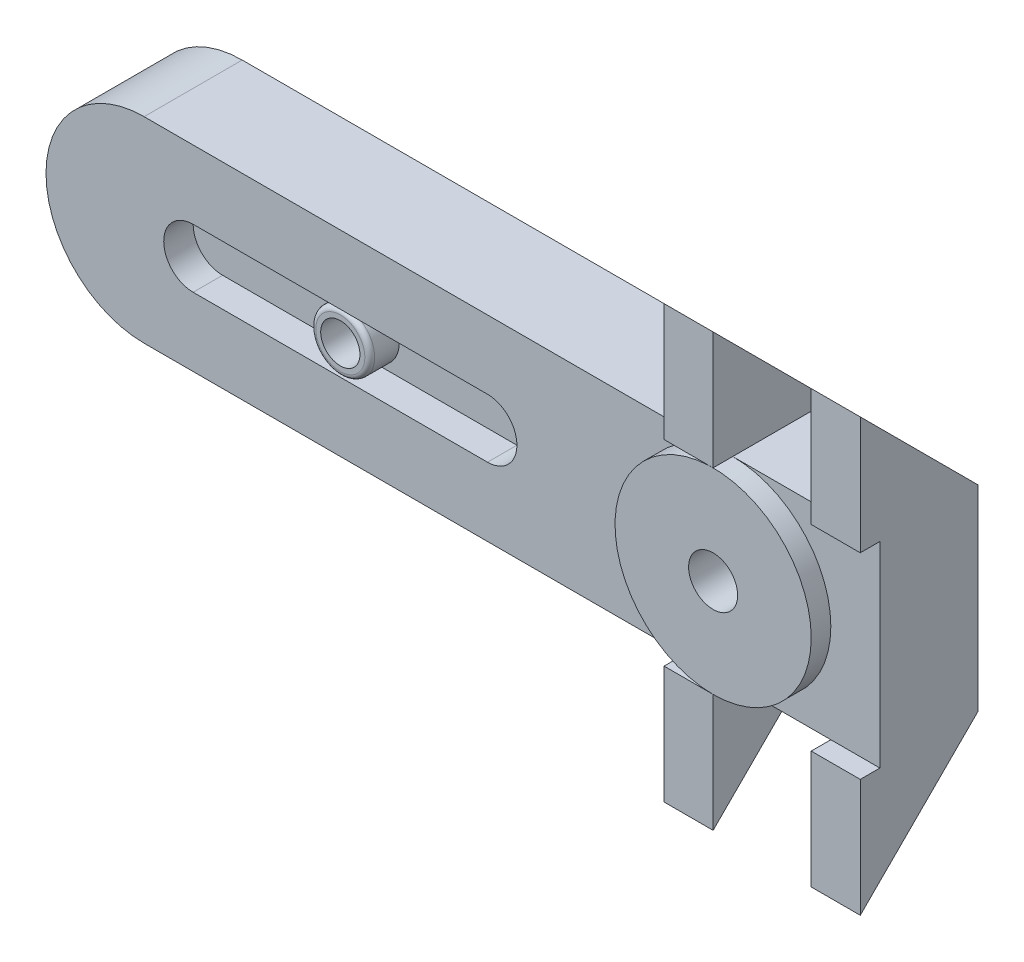
ISO-10303-21;
HEADER;
FILE_DESCRIPTION(('STEP AP214'),'2;1');
FILE_NAME('part.step','',(''),(''),'','','');
FILE_SCHEMA(('AUTOMOTIVE_DESIGN { 1 0 10303 214 1 1 1 1 }'));
ENDSEC;
DATA;
#1=APPLICATION_CONTEXT('core data for automotive mechanical design processes');
#2=APPLICATION_PROTOCOL_DEFINITION('international standard','automotive_design',2000,#1);
#3=PRODUCT_CONTEXT('',#1,'mechanical');
#4=PRODUCT('Part','Part','',(#3));
#5=PRODUCT_RELATED_PRODUCT_CATEGORY('part','',(#4));
#6=PRODUCT_DEFINITION_FORMATION('','',#4);
#7=PRODUCT_DEFINITION_CONTEXT('part definition',#1,'design');
#8=PRODUCT_DEFINITION('design','',#6,#7);
#9=PRODUCT_DEFINITION_SHAPE('','',#8);
#10=(LENGTH_UNIT() NAMED_UNIT(*) SI_UNIT(.MILLI.,.METRE.));
#11=(NAMED_UNIT(*) PLANE_ANGLE_UNIT() SI_UNIT($,.RADIAN.));
#12=(NAMED_UNIT(*) SI_UNIT($,.STERADIAN.) SOLID_ANGLE_UNIT());
#13=UNCERTAINTY_MEASURE_WITH_UNIT(LENGTH_MEASURE(1.E-05),#10,'distance_accuracy_value','');
#14=(GEOMETRIC_REPRESENTATION_CONTEXT(3) GLOBAL_UNCERTAINTY_ASSIGNED_CONTEXT((#13)) GLOBAL_UNIT_ASSIGNED_CONTEXT((#10,
#11,#12)) REPRESENTATION_CONTEXT('',''));
#15=CARTESIAN_POINT('',(0.,0.,0.));
#16=DIRECTION('',(0.,0.,1.));
#17=DIRECTION('',(1.,0.,0.));
#18=AXIS2_PLACEMENT_3D('',#15,#16,#17);
#19=CARTESIAN_POINT('',(16.8518561611012,-19.728530633822,-5.));
#20=DIRECTION('',(-1.,0.,0.));
#21=DIRECTION('',(0.,0.,1.));
#22=AXIS2_PLACEMENT_3D('',#19,#20,#21);
#23=PLANE('',#22);
#24=DIRECTION('',(0.,0.707106781186546,-0.707106781186549));
#25=VECTOR('',#24,1.);
#26=CARTESIAN_POINT('',(16.8518561611012,-13.7285306338219,0.999999999999997));
#27=LINE('',#26,#25);
#28=CARTESIAN_POINT('',(16.8518561611012,-19.728530633822,7.00000000000004));
#29=VERTEX_POINT('',#28);
#30=CARTESIAN_POINT('',(16.8518561611012,-7.72853063382195,-5.));
#31=VERTEX_POINT('',#30);
#32=EDGE_CURVE('E85',#29,#31,#27,.T.);
#33=ORIENTED_EDGE('',*,*,#32,.F.);
#34=DIRECTION('',(0.,-1.,0.));
#35=VECTOR('',#34,1.);
#36=CARTESIAN_POINT('',(16.8518561611012,-19.728530633822,7.));
#37=LINE('',#36,#35);
#38=CARTESIAN_POINT('',(16.8518561611012,-7.72853063382195,7.));
#39=VERTEX_POINT('',#38);
#40=EDGE_CURVE('E101',#39,#29,#37,.T.);
#41=ORIENTED_EDGE('',*,*,#40,.F.);
#42=DIRECTION('',(0.,0.,1.));
#43=VECTOR('',#42,1.);
#44=CARTESIAN_POINT('',(16.8518561611012,-7.72853063382195,-5.));
#45=LINE('',#44,#43);
#46=EDGE_CURVE('E12',#31,#39,#45,.T.);
#47=ORIENTED_EDGE('',*,*,#46,.F.);
#48=EDGE_LOOP('',(#33,#41,#47));
#49=FACE_BOUND('',#48,.T.);
#50=ADVANCED_FACE('F48',(#49),#23,.T.);
#51=CARTESIAN_POINT('',(16.8518561611012,-7.72853063382195,-5.));
#52=DIRECTION('',(0.,1.,0.));
#53=DIRECTION('',(0.,0.,1.));
#54=AXIS2_PLACEMENT_3D('',#51,#52,#53);
#55=PLANE('',#54);
#56=DIRECTION('',(-1.,0.,0.));
#57=VECTOR('',#56,1.);
#58=CARTESIAN_POINT('',(16.8518561611012,-7.72853063382195,7.));
#59=LINE('',#58,#57);
#60=CARTESIAN_POINT('',(21.8518561611012,-7.72853063382195,7.));
#61=VERTEX_POINT('',#60);
#62=EDGE_CURVE('E86',#61,#39,#59,.T.);
#63=ORIENTED_EDGE('',*,*,#62,.F.);
#64=DIRECTION('',(0.,0.,1.));
#65=VECTOR('',#64,1.);
#66=CARTESIAN_POINT('',(21.8518561611012,-7.72853063382195,-5.));
#67=LINE('',#66,#65);
#68=CARTESIAN_POINT('',(21.8518561611012,-7.72853063382195,-5.));
#69=VERTEX_POINT('',#68);
#70=EDGE_CURVE('E51',#69,#61,#67,.T.);
#71=ORIENTED_EDGE('',*,*,#70,.F.);
#72=DIRECTION('',(-1.,0.,0.));
#73=VECTOR('',#72,1.);
#74=CARTESIAN_POINT('',(16.8518561611012,-7.72853063382195,-5.));
#75=LINE('',#74,#73);
#76=EDGE_CURVE('E81',#69,#31,#75,.T.);
#77=ORIENTED_EDGE('',*,*,#76,.T.);
#78=ORIENTED_EDGE('',*,*,#46,.T.);
#79=EDGE_LOOP('',(#63,#71,#77,#78));
#80=FACE_BOUND('',#79,.T.);
#81=ADVANCED_FACE('F92',(#80),#55,.T.);
#82=CARTESIAN_POINT('',(21.8518561611012,-19.728530633822,-5.));
#83=DIRECTION('',(1.,0.,0.));
#84=DIRECTION('',(0.,0.,-1.));
#85=AXIS2_PLACEMENT_3D('',#82,#83,#84);
#86=PLANE('',#85);
#87=DIRECTION('',(0.,-0.707106781186546,0.707106781186549));
#88=VECTOR('',#87,1.);
#89=CARTESIAN_POINT('',(21.8518561611012,-19.728530633822,7.00000000000004));
#90=LINE('',#89,#88);
#91=CARTESIAN_POINT('',(21.8518561611012,-19.728530633822,7.));
#92=VERTEX_POINT('',#91);
#93=EDGE_CURVE('E83',#69,#92,#90,.T.);
#94=ORIENTED_EDGE('',*,*,#93,.F.);
#95=ORIENTED_EDGE('',*,*,#70,.T.);
#96=DIRECTION('',(0.,1.,0.));
#97=VECTOR('',#96,1.);
#98=CARTESIAN_POINT('',(21.8518561611012,-19.728530633822,7.));
#99=LINE('',#98,#97);
#100=EDGE_CURVE('E89',#92,#61,#99,.T.);
#101=ORIENTED_EDGE('',*,*,#100,.F.);
#102=EDGE_LOOP('',(#94,#95,#101));
#103=FACE_BOUND('',#102,.T.);
#104=ADVANCED_FACE('F88',(#103),#86,.T.);
#105=CARTESIAN_POINT('',(0.,0.,7.));
#106=DIRECTION('',(0.,0.,-1.));
#107=DIRECTION('',(-1.,0.,0.));
#108=AXIS2_PLACEMENT_3D('',#105,#106,#107);
#109=PLANE('',#108);
#110=ORIENTED_EDGE('',*,*,#40,.T.);
#111=DIRECTION('',(1.,0.,0.));
#112=VECTOR('',#111,1.);
#113=CARTESIAN_POINT('',(16.8518561611012,-19.728530633822,7.));
#114=LINE('',#113,#112);
#115=EDGE_CURVE('E97',#29,#92,#114,.T.);
#116=ORIENTED_EDGE('',*,*,#115,.T.);
#117=ORIENTED_EDGE('',*,*,#100,.T.);
#118=ORIENTED_EDGE('',*,*,#62,.T.);
#119=EDGE_LOOP('',(#110,#116,#117,#118));
#120=FACE_BOUND('',#119,.T.);
#121=ADVANCED_FACE('F103',(#120),#109,.F.);
#122=CARTESIAN_POINT('',(9.85185616110118,-19.728530633822,7.00000000000004));
#123=DIRECTION('',(0.,0.707106781186549,0.707106781186546));
#124=DIRECTION('',(0.,-0.707106781186546,0.707106781186549));
#125=AXIS2_PLACEMENT_3D('',#122,#123,#124);
#126=PLANE('',#125);
#127=ORIENTED_EDGE('',*,*,#32,.T.);
#128=ORIENTED_EDGE('',*,*,#76,.F.);
#129=ORIENTED_EDGE('',*,*,#93,.T.);
#130=ORIENTED_EDGE('',*,*,#115,.F.);
#131=EDGE_LOOP('',(#127,#128,#129,#130));
#132=FACE_BOUND('',#131,.T.);
#133=ADVANCED_FACE('F82',(#132),#126,.F.);
#134=CLOSED_SHELL('',(#50,#81,#104,#121,#133));
#135=MANIFOLD_SOLID_BREP('B2',#134);
#136=CARTESIAN_POINT('',(16.8518561611012,24.271469366178,-5.));
#137=DIRECTION('',(-1.,0.,0.));
#138=DIRECTION('',(0.,0.,1.));
#139=AXIS2_PLACEMENT_3D('',#136,#137,#138);
#140=PLANE('',#139);
#141=DIRECTION('',(0.,0.707106781186548,0.707106781186548));
#142=VECTOR('',#141,1.);
#143=CARTESIAN_POINT('',(16.8518561611012,18.271469366178,1.));
#144=LINE('',#143,#142);
#145=CARTESIAN_POINT('',(16.8518561611012,12.271469366178,-5.));
#146=VERTEX_POINT('',#145);
#147=CARTESIAN_POINT('',(16.8518561611012,24.271469366178,7.));
#148=VERTEX_POINT('',#147);
#149=EDGE_CURVE('E170',#146,#148,#144,.T.);
#150=ORIENTED_EDGE('',*,*,#149,.F.);
#151=DIRECTION('',(0.,0.,1.));
#152=VECTOR('',#151,1.);
#153=CARTESIAN_POINT('',(16.8518561611012,12.271469366178,-5.));
#154=LINE('',#153,#152);
#155=CARTESIAN_POINT('',(16.8518561611012,12.271469366178,7.));
#156=VERTEX_POINT('',#155);
#157=EDGE_CURVE('E159',#146,#156,#154,.T.);
#158=ORIENTED_EDGE('',*,*,#157,.T.);
#159=DIRECTION('',(0.,-1.,0.));
#160=VECTOR('',#159,1.);
#161=CARTESIAN_POINT('',(16.8518561611012,24.271469366178,7.));
#162=LINE('',#161,#160);
#163=EDGE_CURVE('E205',#148,#156,#162,.T.);
#164=ORIENTED_EDGE('',*,*,#163,.F.);
#165=EDGE_LOOP('',(#150,#158,#164));
#166=FACE_BOUND('',#165,.T.);
#167=ADVANCED_FACE('F156',(#166),#140,.T.);
#168=CARTESIAN_POINT('',(21.8518561611012,24.271469366178,-5.));
#169=DIRECTION('',(1.,0.,0.));
#170=DIRECTION('',(0.,1.,0.));
#171=AXIS2_PLACEMENT_3D('',#168,#169,#170);
#172=PLANE('',#171);
#173=DIRECTION('',(0.,-0.707106781186548,-0.707106781186548));
#174=VECTOR('',#173,1.);
#175=CARTESIAN_POINT('',(21.8518561611012,12.271469366178,-5.));
#176=LINE('',#175,#174);
#177=CARTESIAN_POINT('',(21.8518561611012,24.271469366178,7.));
#178=VERTEX_POINT('',#177);
#179=CARTESIAN_POINT('',(21.8518561611012,12.271469366178,-5.));
#180=VERTEX_POINT('',#179);
#181=EDGE_CURVE('E188',#178,#180,#176,.T.);
#182=ORIENTED_EDGE('',*,*,#181,.F.);
#183=DIRECTION('',(0.,1.,0.));
#184=VECTOR('',#183,1.);
#185=CARTESIAN_POINT('',(21.8518561611012,24.271469366178,7.));
#186=LINE('',#185,#184);
#187=CARTESIAN_POINT('',(21.8518561611012,12.271469366178,7.));
#188=VERTEX_POINT('',#187);
#189=EDGE_CURVE('E197',#188,#178,#186,.T.);
#190=ORIENTED_EDGE('',*,*,#189,.F.);
#191=DIRECTION('',(0.,0.,1.));
#192=VECTOR('',#191,1.);
#193=CARTESIAN_POINT('',(21.8518561611012,12.271469366178,-5.));
#194=LINE('',#193,#192);
#195=EDGE_CURVE('E46',#180,#188,#194,.T.);
#196=ORIENTED_EDGE('',*,*,#195,.F.);
#197=EDGE_LOOP('',(#182,#190,#196));
#198=FACE_BOUND('',#197,.T.);
#199=ADVANCED_FACE('F196',(#198),#172,.T.);
#200=CARTESIAN_POINT('',(16.8518561611012,12.271469366178,-5.));
#201=DIRECTION('',(0.,-1.,0.));
#202=DIRECTION('',(0.,0.,-1.));
#203=AXIS2_PLACEMENT_3D('',#200,#201,#202);
#204=PLANE('',#203);
#205=DIRECTION('',(1.,0.,0.));
#206=VECTOR('',#205,1.);
#207=CARTESIAN_POINT('',(16.8518561611012,12.271469366178,7.));
#208=LINE('',#207,#206);
#209=EDGE_CURVE('E208',#156,#188,#208,.T.);
#210=ORIENTED_EDGE('',*,*,#209,.F.);
#211=ORIENTED_EDGE('',*,*,#157,.F.);
#212=DIRECTION('',(1.,0.,0.));
#213=VECTOR('',#212,1.);
#214=CARTESIAN_POINT('',(16.8518561611012,12.271469366178,-5.));
#215=LINE('',#214,#213);
#216=EDGE_CURVE('E190',#146,#180,#215,.T.);
#217=ORIENTED_EDGE('',*,*,#216,.T.);
#218=ORIENTED_EDGE('',*,*,#195,.T.);
#219=EDGE_LOOP('',(#210,#211,#217,#218));
#220=FACE_BOUND('',#219,.T.);
#221=ADVANCED_FACE('F200',(#220),#204,.T.);
#222=CARTESIAN_POINT('',(0.,0.,7.));
#223=DIRECTION('',(0.,0.,1.));
#224=DIRECTION('',(1.,0.,0.));
#225=AXIS2_PLACEMENT_3D('',#222,#223,#224);
#226=PLANE('',#225);
#227=ORIENTED_EDGE('',*,*,#163,.T.);
#228=ORIENTED_EDGE('',*,*,#209,.T.);
#229=ORIENTED_EDGE('',*,*,#189,.T.);
#230=DIRECTION('',(-1.,0.,0.));
#231=VECTOR('',#230,1.);
#232=CARTESIAN_POINT('',(16.8518561611012,24.271469366178,7.));
#233=LINE('',#232,#231);
#234=EDGE_CURVE('E192',#178,#148,#233,.T.);
#235=ORIENTED_EDGE('',*,*,#234,.T.);
#236=EDGE_LOOP('',(#227,#228,#229,#235));
#237=FACE_BOUND('',#236,.T.);
#238=ADVANCED_FACE('F211',(#237),#226,.T.);
#239=CARTESIAN_POINT('',(9.85185616110117,12.271469366178,-5.));
#240=DIRECTION('',(0.,-0.707106781186547,0.707106781186547));
#241=DIRECTION('',(0.,-0.707106781186548,-0.707106781186548));
#242=AXIS2_PLACEMENT_3D('',#239,#240,#241);
#243=PLANE('',#242);
#244=ORIENTED_EDGE('',*,*,#149,.T.);
#245=ORIENTED_EDGE('',*,*,#234,.F.);
#246=ORIENTED_EDGE('',*,*,#181,.T.);
#247=ORIENTED_EDGE('',*,*,#216,.F.);
#248=EDGE_LOOP('',(#244,#245,#246,#247));
#249=FACE_BOUND('',#248,.T.);
#250=ADVANCED_FACE('F189',(#249),#243,.F.);
#251=CLOSED_SHELL('',(#167,#199,#221,#238,#250));
#252=MANIFOLD_SOLID_BREP('B6',#251);
#253=CARTESIAN_POINT('',(41.8518561611012,-7.72853063382194,-5.));
#254=DIRECTION('',(0.,1.,0.));
#255=DIRECTION('',(0.,0.,1.));
#256=AXIS2_PLACEMENT_3D('',#253,#254,#255);
#257=PLANE('',#256);
#258=DIRECTION('',(0.,0.,1.));
#259=VECTOR('',#258,1.);
#260=CARTESIAN_POINT('',(31.8518561611012,-7.72853063382195,-5.));
#261=LINE('',#260,#259);
#262=CARTESIAN_POINT('',(31.8518561611012,-7.72853063382195,-5.));
#263=VERTEX_POINT('',#262);
#264=CARTESIAN_POINT('',(31.8518561611012,-7.72853063382192,5.));
#265=VERTEX_POINT('',#264);
#266=EDGE_CURVE('E374',#263,#265,#261,.T.);
#267=ORIENTED_EDGE('',*,*,#266,.T.);
#268=DIRECTION('',(1.,0.,0.));
#269=VECTOR('',#268,1.);
#270=CARTESIAN_POINT('',(0.,-7.72853063382195,5.));
#271=LINE('',#270,#269);
#272=CARTESIAN_POINT('',(21.8518561611012,-7.72853063382195,5.));
#273=VERTEX_POINT('',#272);
#274=EDGE_CURVE('E451',#273,#265,#271,.T.);
#275=ORIENTED_EDGE('',*,*,#274,.F.);
#276=CARTESIAN_POINT('',(-38.1481438388988,-7.72853063382194,5.));
#277=VERTEX_POINT('',#276);
#278=EDGE_CURVE('E453',#277,#273,#271,.T.);
#279=ORIENTED_EDGE('',*,*,#278,.F.);
#280=DIRECTION('',(0.,0.,-1.));
#281=VECTOR('',#280,1.);
#282=CARTESIAN_POINT('',(-38.1481438388988,-7.72853063382194,-5.));
#283=LINE('',#282,#281);
#284=CARTESIAN_POINT('',(-38.1481438388988,-7.72853063382194,-5.));
#285=VERTEX_POINT('',#284);
#286=EDGE_CURVE('E399',#277,#285,#283,.T.);
#287=ORIENTED_EDGE('',*,*,#286,.T.);
#288=DIRECTION('',(-1.,0.,0.));
#289=VECTOR('',#288,1.);
#290=CARTESIAN_POINT('',(41.8518561611012,-7.72853063382194,-5.));
#291=LINE('',#290,#289);
#292=EDGE_CURVE('E397',#263,#285,#291,.T.);
#293=ORIENTED_EDGE('',*,*,#292,.F.);
#294=EDGE_LOOP('',(#267,#275,#279,#287,#293));
#295=FACE_BOUND('',#294,.T.);
#296=ADVANCED_FACE('F263',(#295),#257,.F.);
#297=CARTESIAN_POINT('',(31.8518561611012,12.271469366178,-5.));
#298=DIRECTION('',(0.,-1.,0.));
#299=DIRECTION('',(0.,0.,-1.));
#300=AXIS2_PLACEMENT_3D('',#297,#298,#299);
#301=PLANE('',#300);
#302=DIRECTION('',(0.,0.,-1.));
#303=VECTOR('',#302,1.);
#304=CARTESIAN_POINT('',(31.8518561611012,12.271469366178,-5.));
#305=LINE('',#304,#303);
#306=CARTESIAN_POINT('',(31.8518561611012,12.271469366178,7.));
#307=VERTEX_POINT('',#306);
#308=CARTESIAN_POINT('',(31.8518561611012,12.271469366178,5.));
#309=VERTEX_POINT('',#308);
#310=EDGE_CURVE('E522',#307,#309,#305,.T.);
#311=ORIENTED_EDGE('',*,*,#310,.T.);
#312=DIRECTION('',(1.,0.,0.));
#313=VECTOR('',#312,1.);
#314=CARTESIAN_POINT('',(0.,12.2714693661781,5.));
#315=LINE('',#314,#313);
#316=CARTESIAN_POINT('',(36.8518561611012,12.271469366178,5.));
#317=VERTEX_POINT('',#316);
#318=EDGE_CURVE('E449',#309,#317,#315,.T.);
#319=ORIENTED_EDGE('',*,*,#318,.T.);
#320=DIRECTION('',(0.,0.,-1.));
#321=VECTOR('',#320,1.);
#322=CARTESIAN_POINT('',(36.8518561611012,12.271469366178,-5.));
#323=LINE('',#322,#321);
#324=CARTESIAN_POINT('',(36.8518561611012,12.271469366178,7.));
#325=VERTEX_POINT('',#324);
#326=EDGE_CURVE('E504',#325,#317,#323,.T.);
#327=ORIENTED_EDGE('',*,*,#326,.F.);
#328=DIRECTION('',(1.,0.,0.));
#329=VECTOR('',#328,1.);
#330=CARTESIAN_POINT('',(31.8518561611012,12.271469366178,7.));
#331=LINE('',#330,#329);
#332=EDGE_CURVE('E519',#307,#325,#331,.T.);
#333=ORIENTED_EDGE('',*,*,#332,.F.);
#334=EDGE_LOOP('',(#311,#319,#327,#333));
#335=FACE_BOUND('',#334,.T.);
#336=ADVANCED_FACE('F550',(#335),#301,.T.);
#337=CARTESIAN_POINT('',(-38.1481438388988,2.27146936617805,-5.));
#338=DIRECTION('',(0.,0.,-1.));
#339=DIRECTION('',(-1.,0.,0.));
#340=AXIS2_PLACEMENT_3D('',#337,#338,#339);
#341=CYLINDRICAL_SURFACE('',#340,10.);
#342=DIRECTION('',(0.,0.,-1.));
#343=VECTOR('',#342,1.);
#344=CARTESIAN_POINT('',(-48.1481438388988,2.27146936617806,-5.));
#345=LINE('',#344,#343);
#346=CARTESIAN_POINT('',(-48.1481438388988,2.27146936617806,-5.));
#347=VERTEX_POINT('',#346);
#348=CARTESIAN_POINT('',(-48.1481438388988,2.27146936617806,5.));
#349=VERTEX_POINT('',#348);
#350=EDGE_CURVE('E417',#347,#349,#345,.F.);
#351=ORIENTED_EDGE('',*,*,#350,.T.);
#352=CARTESIAN_POINT('',(-38.1481438388988,2.27146936617806,5.));
#353=DIRECTION('',(0.,0.,-1.));
#354=DIRECTION('',(-1.,0.,0.));
#355=AXIS2_PLACEMENT_3D('',#352,#353,#354);
#356=CIRCLE('',#355,10.);
#357=CARTESIAN_POINT('',(-38.1481438388988,12.2714693661781,5.));
#358=VERTEX_POINT('',#357);
#359=EDGE_CURVE('E432',#358,#349,#356,.F.);
#360=ORIENTED_EDGE('',*,*,#359,.F.);
#361=DIRECTION('',(0.,0.,-1.));
#362=VECTOR('',#361,1.);
#363=CARTESIAN_POINT('',(-38.1481438388988,12.2714693661781,-5.));
#364=LINE('',#363,#362);
#365=CARTESIAN_POINT('',(-38.1481438388988,12.2714693661781,-5.));
#366=VERTEX_POINT('',#365);
#367=EDGE_CURVE('E271',#366,#358,#364,.F.);
#368=ORIENTED_EDGE('',*,*,#367,.F.);
#369=CARTESIAN_POINT('',(-38.1481438388988,2.27146936617805,-5.));
#370=DIRECTION('',(0.,0.,-1.));
#371=DIRECTION('',(-1.,0.,0.));
#372=AXIS2_PLACEMENT_3D('',#369,#370,#371);
#373=CIRCLE('',#372,10.);
#374=EDGE_CURVE('E154',#347,#366,#373,.T.);
#375=ORIENTED_EDGE('',*,*,#374,.F.);
#376=EDGE_LOOP('',(#351,#360,#368,#375));
#377=FACE_BOUND('',#376,.T.);
#378=ADVANCED_FACE('F265',(#377),#341,.T.);
#379=CARTESIAN_POINT('',(-38.1481438388988,2.27146936617806,-5.));
#380=DIRECTION('',(0.,0.,-1.));
#381=DIRECTION('',(-1.,0.,0.));
#382=AXIS2_PLACEMENT_3D('',#379,#380,#381);
#383=CYLINDRICAL_SURFACE('',#382,10.);
#384=ORIENTED_EDGE('',*,*,#286,.F.);
#385=CARTESIAN_POINT('',(-38.1481438388988,2.27146936617806,5.));
#386=DIRECTION('',(0.,0.,-1.));
#387=DIRECTION('',(-1.,0.,0.));
#388=AXIS2_PLACEMENT_3D('',#385,#386,#387);
#389=CIRCLE('',#388,10.);
#390=EDGE_CURVE('E438',#349,#277,#389,.F.);
#391=ORIENTED_EDGE('',*,*,#390,.F.);
#392=ORIENTED_EDGE('',*,*,#350,.F.);
#393=CARTESIAN_POINT('',(-38.1481438388988,2.27146936617806,-5.));
#394=DIRECTION('',(0.,0.,-1.));
#395=DIRECTION('',(-1.,0.,0.));
#396=AXIS2_PLACEMENT_3D('',#393,#394,#395);
#397=CIRCLE('',#396,10.);
#398=EDGE_CURVE('E419',#285,#347,#397,.T.);
#399=ORIENTED_EDGE('',*,*,#398,.F.);
#400=EDGE_LOOP('',(#384,#391,#392,#399));
#401=FACE_BOUND('',#400,.T.);
#402=ADVANCED_FACE('F558',(#401),#383,.T.);
#403=CARTESIAN_POINT('',(41.8518561611012,12.271469366178,-5.));
#404=DIRECTION('',(0.,-1.,0.));
#405=DIRECTION('',(1.,0.,0.));
#406=AXIS2_PLACEMENT_3D('',#403,#404,#405);
#407=PLANE('',#406);
#408=ORIENTED_EDGE('',*,*,#367,.T.);
#409=CARTESIAN_POINT('',(21.8518561611012,12.271469366178,5.));
#410=VERTEX_POINT('',#409);
#411=EDGE_CURVE('E427',#358,#410,#315,.T.);
#412=ORIENTED_EDGE('',*,*,#411,.T.);
#413=EDGE_CURVE('E447',#410,#309,#315,.T.);
#414=ORIENTED_EDGE('',*,*,#413,.T.);
#415=CARTESIAN_POINT('',(31.8518561611012,12.271469366178,-5.));
#416=VERTEX_POINT('',#415);
#417=EDGE_CURVE('E587',#309,#416,#305,.T.);
#418=ORIENTED_EDGE('',*,*,#417,.T.);
#419=DIRECTION('',(1.,0.,0.));
#420=VECTOR('',#419,1.);
#421=CARTESIAN_POINT('',(41.8518561611012,12.271469366178,-5.));
#422=LINE('',#421,#420);
#423=EDGE_CURVE('E411',#366,#416,#422,.T.);
#424=ORIENTED_EDGE('',*,*,#423,.F.);
#425=EDGE_LOOP('',(#408,#412,#414,#418,#424));
#426=FACE_BOUND('',#425,.T.);
#427=ADVANCED_FACE('F424',(#426),#407,.F.);
#428=CARTESIAN_POINT('',(0.,0.,-5.));
#429=DIRECTION('',(0.,0.,-1.));
#430=DIRECTION('',(-1.,0.,0.));
#431=AXIS2_PLACEMENT_3D('',#428,#429,#430);
#432=PLANE('',#431);
#433=DIRECTION('',(0.,-1.,0.));
#434=VECTOR('',#433,1.);
#435=CARTESIAN_POINT('',(36.8518561611012,12.271469366178,-5.));
#436=LINE('',#435,#434);
#437=CARTESIAN_POINT('',(36.8518561611012,12.271469366178,-5.));
#438=VERTEX_POINT('',#437);
#439=CARTESIAN_POINT('',(36.8518561611012,-7.72853063382195,-5.));
#440=VERTEX_POINT('',#439);
#441=EDGE_CURVE('E410',#438,#440,#436,.T.);
#442=ORIENTED_EDGE('',*,*,#441,.T.);
#443=EDGE_CURVE('E391',#440,#263,#291,.T.);
#444=ORIENTED_EDGE('',*,*,#443,.T.);
#445=ORIENTED_EDGE('',*,*,#292,.T.);
#446=ORIENTED_EDGE('',*,*,#398,.T.);
#447=ORIENTED_EDGE('',*,*,#374,.T.);
#448=ORIENTED_EDGE('',*,*,#423,.T.);
#449=DIRECTION('',(1.,0.,0.));
#450=VECTOR('',#449,1.);
#451=CARTESIAN_POINT('',(31.8518561611012,12.271469366178,-5.));
#452=LINE('',#451,#450);
#453=EDGE_CURVE('E517',#416,#438,#452,.T.);
#454=ORIENTED_EDGE('',*,*,#453,.T.);
#455=EDGE_LOOP('',(#442,#444,#445,#446,#447,#448,#454));
#456=FACE_BOUND('',#455,.T.);
#457=CARTESIAN_POINT('',(21.8518561611012,2.27146936617805,-5.));
#458=DIRECTION('',(0.,0.,1.));
#459=DIRECTION('',(1.,0.,0.));
#460=AXIS2_PLACEMENT_3D('',#457,#458,#459);
#461=CIRCLE('',#460,2.5);
#462=CARTESIAN_POINT('',(24.3518561611012,2.27146936617805,-5.));
#463=VERTEX_POINT('',#462);
#464=EDGE_CURVE('E403',#463,#463,#461,.T.);
#465=ORIENTED_EDGE('',*,*,#464,.T.);
#466=EDGE_LOOP('',(#465));
#467=FACE_BOUND('',#466,.T.);
#468=ADVANCED_FACE('F406',(#456,#467),#432,.T.);
#469=CARTESIAN_POINT('',(21.8518561611012,2.27146936617805,-5.));
#470=DIRECTION('',(0.,0.,1.));
#471=DIRECTION('',(1.,0.,0.));
#472=AXIS2_PLACEMENT_3D('',#469,#470,#471);
#473=CYLINDRICAL_SURFACE('',#472,2.5);
#474=ORIENTED_EDGE('',*,*,#464,.F.);
#475=EDGE_LOOP('',(#474));
#476=FACE_BOUND('',#475,.T.);
#477=CARTESIAN_POINT('',(21.8518561611012,2.27146936617805,7.));
#478=DIRECTION('',(0.,0.,1.));
#479=DIRECTION('',(1.,0.,0.));
#480=AXIS2_PLACEMENT_3D('',#477,#478,#479);
#481=CIRCLE('',#480,2.5);
#482=CARTESIAN_POINT('',(24.3518561611012,2.27146936617805,7.));
#483=VERTEX_POINT('',#482);
#484=EDGE_CURVE('E473',#483,#483,#481,.T.);
#485=ORIENTED_EDGE('',*,*,#484,.T.);
#486=EDGE_LOOP('',(#485));
#487=FACE_BOUND('',#486,.T.);
#488=ADVANCED_FACE('F526',(#476,#487),#473,.F.);
#489=CARTESIAN_POINT('',(36.8518561611012,12.271469366178,-5.));
#490=DIRECTION('',(-1.,0.,0.));
#491=DIRECTION('',(0.,0.,1.));
#492=AXIS2_PLACEMENT_3D('',#489,#490,#491);
#493=PLANE('',#492);
#494=DIRECTION('',(0.,-1.,0.));
#495=VECTOR('',#494,1.);
#496=CARTESIAN_POINT('',(36.8518561611012,12.271469366178,5.));
#497=LINE('',#496,#495);
#498=CARTESIAN_POINT('',(36.8518561611012,-7.72853063382195,5.));
#499=VERTEX_POINT('',#498);
#500=EDGE_CURVE('E479',#317,#499,#497,.T.);
#501=ORIENTED_EDGE('',*,*,#500,.T.);
#502=DIRECTION('',(0.,0.,1.));
#503=VECTOR('',#502,1.);
#504=CARTESIAN_POINT('',(36.8518561611012,-7.72853063382195,-5.));
#505=LINE('',#504,#503);
#506=CARTESIAN_POINT('',(36.8518561611012,-7.72853063382191,7.));
#507=VERTEX_POINT('',#506);
#508=EDGE_CURVE('E488',#499,#507,#505,.T.);
#509=ORIENTED_EDGE('',*,*,#508,.T.);
#510=DIRECTION('',(0.,-1.,0.));
#511=VECTOR('',#510,1.);
#512=CARTESIAN_POINT('',(36.8518561611012,-7.72853063382191,7.));
#513=LINE('',#512,#511);
#514=CARTESIAN_POINT('',(36.8518561611012,-19.7285306338219,7.));
#515=VERTEX_POINT('',#514);
#516=EDGE_CURVE('E394',#507,#515,#513,.T.);
#517=ORIENTED_EDGE('',*,*,#516,.T.);
#518=DIRECTION('',(0.,0.707106781186546,-0.707106781186549));
#519=VECTOR('',#518,1.);
#520=CARTESIAN_POINT('',(36.8518561611012,-19.7285306338219,7.));
#521=LINE('',#520,#519);
#522=EDGE_CURVE('E490',#515,#440,#521,.T.);
#523=ORIENTED_EDGE('',*,*,#522,.T.);
#524=ORIENTED_EDGE('',*,*,#441,.F.);
#525=DIRECTION('',(0.,0.707106781186548,0.707106781186548));
#526=VECTOR('',#525,1.);
#527=CARTESIAN_POINT('',(36.8518561611012,24.271469366178,7.));
#528=LINE('',#527,#526);
#529=CARTESIAN_POINT('',(36.8518561611012,24.271469366178,7.));
#530=VERTEX_POINT('',#529);
#531=EDGE_CURVE('E513',#438,#530,#528,.T.);
#532=ORIENTED_EDGE('',*,*,#531,.T.);
#533=DIRECTION('',(0.,-1.,0.));
#534=VECTOR('',#533,1.);
#535=CARTESIAN_POINT('',(36.8518561611012,12.271469366178,7.));
#536=LINE('',#535,#534);
#537=EDGE_CURVE('E507',#530,#325,#536,.T.);
#538=ORIENTED_EDGE('',*,*,#537,.T.);
#539=ORIENTED_EDGE('',*,*,#326,.T.);
#540=EDGE_LOOP('',(#501,#509,#517,#523,#524,#532,#538,#539));
#541=FACE_BOUND('',#540,.T.);
#542=ADVANCED_FACE('F502',(#541),#493,.F.);
#543=CARTESIAN_POINT('',(31.8518561611012,24.271469366178,7.));
#544=DIRECTION('',(0.,0.707106781186548,-0.707106781186548));
#545=DIRECTION('',(0.,0.707106781186548,0.707106781186548));
#546=AXIS2_PLACEMENT_3D('',#543,#544,#545);
#547=PLANE('',#546);
#548=ORIENTED_EDGE('',*,*,#531,.F.);
#549=ORIENTED_EDGE('',*,*,#453,.F.);
#550=DIRECTION('',(0.,0.707106781186548,0.707106781186548));
#551=VECTOR('',#550,1.);
#552=CARTESIAN_POINT('',(31.8518561611012,24.271469366178,7.));
#553=LINE('',#552,#551);
#554=CARTESIAN_POINT('',(31.8518561611012,24.271469366178,7.));
#555=VERTEX_POINT('',#554);
#556=EDGE_CURVE('E508',#416,#555,#553,.T.);
#557=ORIENTED_EDGE('',*,*,#556,.T.);
#558=DIRECTION('',(1.,0.,0.));
#559=VECTOR('',#558,1.);
#560=CARTESIAN_POINT('',(31.8518561611012,24.271469366178,7.));
#561=LINE('',#560,#559);
#562=EDGE_CURVE('E521',#555,#530,#561,.T.);
#563=ORIENTED_EDGE('',*,*,#562,.T.);
#564=EDGE_LOOP('',(#548,#549,#557,#563));
#565=FACE_BOUND('',#564,.T.);
#566=ADVANCED_FACE('F598',(#565),#547,.T.);
#567=CARTESIAN_POINT('',(31.8518561611012,12.271469366178,7.));
#568=DIRECTION('',(0.,0.,1.));
#569=DIRECTION('',(1.,0.,0.));
#570=AXIS2_PLACEMENT_3D('',#567,#568,#569);
#571=PLANE('',#570);
#572=ORIENTED_EDGE('',*,*,#537,.F.);
#573=ORIENTED_EDGE('',*,*,#562,.F.);
#574=DIRECTION('',(0.,-1.,0.));
#575=VECTOR('',#574,1.);
#576=CARTESIAN_POINT('',(31.8518561611012,12.271469366178,7.));
#577=LINE('',#576,#575);
#578=EDGE_CURVE('E511',#555,#307,#577,.T.);
#579=ORIENTED_EDGE('',*,*,#578,.T.);
#580=ORIENTED_EDGE('',*,*,#332,.T.);
#581=EDGE_LOOP('',(#572,#573,#579,#580));
#582=FACE_BOUND('',#581,.T.);
#583=ADVANCED_FACE('F595',(#582),#571,.T.);
#584=CARTESIAN_POINT('',(31.8518561611012,0.,0.));
#585=DIRECTION('',(-1.,0.,0.));
#586=DIRECTION('',(0.,0.,1.));
#587=AXIS2_PLACEMENT_3D('',#584,#585,#586);
#588=PLANE('',#587);
#589=ORIENTED_EDGE('',*,*,#556,.F.);
#590=ORIENTED_EDGE('',*,*,#417,.F.);
#591=ORIENTED_EDGE('',*,*,#310,.F.);
#592=ORIENTED_EDGE('',*,*,#578,.F.);
#593=EDGE_LOOP('',(#589,#590,#591,#592));
#594=FACE_BOUND('',#593,.T.);
#595=ADVANCED_FACE('F592',(#594),#588,.T.);
#596=CARTESIAN_POINT('',(0.,0.,5.));
#597=DIRECTION('',(0.,0.,-1.));
#598=DIRECTION('',(-1.,0.,0.));
#599=AXIS2_PLACEMENT_3D('',#596,#597,#598);
#600=PLANE('',#599);
#601=CARTESIAN_POINT('',(-33.1481438388988,2.27146936617805,5.));
#602=DIRECTION('',(0.,0.,-1.));
#603=DIRECTION('',(-1.,0.,0.));
#604=AXIS2_PLACEMENT_3D('',#601,#602,#603);
#605=CIRCLE('',#604,3.);
#606=CARTESIAN_POINT('',(-33.1481438388988,-0.728530633821944,5.));
#607=VERTEX_POINT('',#606);
#608=CARTESIAN_POINT('',(-33.1481438388988,5.27146936617805,5.));
#609=VERTEX_POINT('',#608);
#610=EDGE_CURVE('E469',#607,#609,#605,.T.);
#611=ORIENTED_EDGE('',*,*,#610,.T.);
#612=DIRECTION('',(1.,0.,0.));
#613=VECTOR('',#612,1.);
#614=CARTESIAN_POINT('',(0.,5.27146936617805,5.));
#615=LINE('',#614,#613);
#616=CARTESIAN_POINT('',(-3.14814383889883,5.27146936617805,5.));
#617=VERTEX_POINT('',#616);
#618=EDGE_CURVE('E455',#609,#617,#615,.T.);
#619=ORIENTED_EDGE('',*,*,#618,.T.);
#620=CARTESIAN_POINT('',(-3.14814383889883,2.27146936617805,5.));
#621=DIRECTION('',(0.,0.,-1.));
#622=DIRECTION('',(-1.,0.,0.));
#623=AXIS2_PLACEMENT_3D('',#620,#621,#622);
#624=CIRCLE('',#623,3.);
#625=CARTESIAN_POINT('',(-3.14814383889883,-0.728530633821944,5.));
#626=VERTEX_POINT('',#625);
#627=EDGE_CURVE('E461',#617,#626,#624,.T.);
#628=ORIENTED_EDGE('',*,*,#627,.T.);
#629=DIRECTION('',(-1.,0.,0.));
#630=VECTOR('',#629,1.);
#631=CARTESIAN_POINT('',(0.,-0.728530633821944,5.));
#632=LINE('',#631,#630);
#633=EDGE_CURVE('E465',#626,#607,#632,.T.);
#634=ORIENTED_EDGE('',*,*,#633,.T.);
#635=EDGE_LOOP('',(#611,#619,#628,#634));
#636=FACE_BOUND('',#635,.T.);
#637=CARTESIAN_POINT('',(21.8518561611012,2.27146936617805,5.));
#638=DIRECTION('',(0.,0.,1.));
#639=DIRECTION('',(1.,0.,0.));
#640=AXIS2_PLACEMENT_3D('',#637,#638,#639);
#641=CIRCLE('',#640,9.99999999999999);
#642=EDGE_CURVE('E444',#410,#273,#641,.T.);
#643=ORIENTED_EDGE('',*,*,#642,.F.);
#644=ORIENTED_EDGE('',*,*,#411,.F.);
#645=ORIENTED_EDGE('',*,*,#359,.T.);
#646=ORIENTED_EDGE('',*,*,#390,.T.);
#647=ORIENTED_EDGE('',*,*,#278,.T.);
#648=EDGE_LOOP('',(#643,#644,#645,#646,#647));
#649=FACE_BOUND('',#648,.T.);
#650=ADVANCED_FACE('F441',(#636,#649),#600,.F.);
#651=ORIENTED_EDGE('',*,*,#274,.T.);
#652=EDGE_CURVE('E446',#265,#499,#271,.T.);
#653=ORIENTED_EDGE('',*,*,#652,.T.);
#654=ORIENTED_EDGE('',*,*,#500,.F.);
#655=ORIENTED_EDGE('',*,*,#318,.F.);
#656=ORIENTED_EDGE('',*,*,#413,.F.);
#657=EDGE_CURVE('E437',#273,#410,#641,.T.);
#658=ORIENTED_EDGE('',*,*,#657,.F.);
#659=EDGE_LOOP('',(#651,#653,#654,#655,#656,#658));
#660=FACE_BOUND('',#659,.T.);
#661=ADVANCED_FACE('F500',(#660),#600,.F.);
#662=CARTESIAN_POINT('',(-33.1481438388988,2.27146936617805,5.));
#663=DIRECTION('',(0.,0.,-1.));
#664=DIRECTION('',(-1.,0.,0.));
#665=AXIS2_PLACEMENT_3D('',#662,#663,#664);
#666=CYLINDRICAL_SURFACE('',#665,3.);
#667=CARTESIAN_POINT('',(-33.1481438388988,2.27146936617805,0.));
#668=DIRECTION('',(0.,0.,-1.));
#669=DIRECTION('',(-1.,0.,0.));
#670=AXIS2_PLACEMENT_3D('',#667,#668,#669);
#671=CIRCLE('',#670,3.);
#672=CARTESIAN_POINT('',(-33.1481438388988,-0.728530633821944,0.));
#673=VERTEX_POINT('',#672);
#674=CARTESIAN_POINT('',(-33.1481438388988,5.27146936617805,0.));
#675=VERTEX_POINT('',#674);
#676=EDGE_CURVE('E476',#673,#675,#671,.T.);
#677=ORIENTED_EDGE('',*,*,#676,.T.);
#678=DIRECTION('',(0.,0.,-1.));
#679=VECTOR('',#678,1.);
#680=CARTESIAN_POINT('',(-33.1481438388988,5.27146936617805,5.));
#681=LINE('',#680,#679);
#682=EDGE_CURVE('E565',#609,#675,#681,.T.);
#683=ORIENTED_EDGE('',*,*,#682,.F.);
#684=ORIENTED_EDGE('',*,*,#610,.F.);
#685=DIRECTION('',(0.,0.,-1.));
#686=VECTOR('',#685,1.);
#687=CARTESIAN_POINT('',(-33.1481438388988,-0.728530633821944,5.));
#688=LINE('',#687,#686);
#689=EDGE_CURVE('E567',#607,#673,#688,.T.);
#690=ORIENTED_EDGE('',*,*,#689,.T.);
#691=EDGE_LOOP('',(#677,#683,#684,#690));
#692=FACE_BOUND('',#691,.T.);
#693=ADVANCED_FACE('F620',(#692),#666,.F.);
#694=CARTESIAN_POINT('',(0.,5.27146936617805,5.));
#695=DIRECTION('',(0.,1.,0.));
#696=DIRECTION('',(0.,0.,1.));
#697=AXIS2_PLACEMENT_3D('',#694,#695,#696);
#698=PLANE('',#697);
#699=DIRECTION('',(1.,0.,0.));
#700=VECTOR('',#699,1.);
#701=CARTESIAN_POINT('',(0.,5.27146936617805,0.));
#702=LINE('',#701,#700);
#703=CARTESIAN_POINT('',(-3.14814383889883,5.27146936617805,0.));
#704=VERTEX_POINT('',#703);
#705=EDGE_CURVE('E278',#675,#704,#702,.T.);
#706=ORIENTED_EDGE('',*,*,#705,.T.);
#707=DIRECTION('',(0.,0.,-1.));
#708=VECTOR('',#707,1.);
#709=CARTESIAN_POINT('',(-3.14814383889883,5.27146936617805,5.));
#710=LINE('',#709,#708);
#711=EDGE_CURVE('E580',#617,#704,#710,.T.);
#712=ORIENTED_EDGE('',*,*,#711,.F.);
#713=ORIENTED_EDGE('',*,*,#618,.F.);
#714=ORIENTED_EDGE('',*,*,#682,.T.);
#715=EDGE_LOOP('',(#706,#712,#713,#714));
#716=FACE_BOUND('',#715,.T.);
#717=ADVANCED_FACE('F624',(#716),#698,.F.);
#718=CARTESIAN_POINT('',(-3.14814383889883,2.27146936617805,5.));
#719=DIRECTION('',(0.,0.,-1.));
#720=DIRECTION('',(-1.,0.,0.));
#721=AXIS2_PLACEMENT_3D('',#718,#719,#720);
#722=CYLINDRICAL_SURFACE('',#721,3.);
#723=CARTESIAN_POINT('',(-3.14814383889883,2.27146936617805,0.));
#724=DIRECTION('',(0.,0.,-1.));
#725=DIRECTION('',(-1.,0.,0.));
#726=AXIS2_PLACEMENT_3D('',#723,#724,#725);
#727=CIRCLE('',#726,3.);
#728=CARTESIAN_POINT('',(-3.14814383889883,-0.728530633821944,0.));
#729=VERTEX_POINT('',#728);
#730=EDGE_CURVE('E283',#704,#729,#727,.T.);
#731=ORIENTED_EDGE('',*,*,#730,.T.);
#732=DIRECTION('',(0.,0.,-1.));
#733=VECTOR('',#732,1.);
#734=CARTESIAN_POINT('',(-3.14814383889883,-0.728530633821944,5.));
#735=LINE('',#734,#733);
#736=EDGE_CURVE('E569',#626,#729,#735,.T.);
#737=ORIENTED_EDGE('',*,*,#736,.F.);
#738=ORIENTED_EDGE('',*,*,#627,.F.);
#739=ORIENTED_EDGE('',*,*,#711,.T.);
#740=EDGE_LOOP('',(#731,#737,#738,#739));
#741=FACE_BOUND('',#740,.T.);
#742=ADVANCED_FACE('F545',(#741),#722,.F.);
#743=CARTESIAN_POINT('',(0.,-0.728530633821944,5.));
#744=DIRECTION('',(0.,-1.,0.));
#745=DIRECTION('',(0.,0.,-1.));
#746=AXIS2_PLACEMENT_3D('',#743,#744,#745);
#747=PLANE('',#746);
#748=DIRECTION('',(-1.,0.,0.));
#749=VECTOR('',#748,1.);
#750=CARTESIAN_POINT('',(0.,-0.728530633821944,0.));
#751=LINE('',#750,#749);
#752=EDGE_CURVE('E574',#729,#673,#751,.T.);
#753=ORIENTED_EDGE('',*,*,#752,.T.);
#754=ORIENTED_EDGE('',*,*,#689,.F.);
#755=ORIENTED_EDGE('',*,*,#633,.F.);
#756=ORIENTED_EDGE('',*,*,#736,.T.);
#757=EDGE_LOOP('',(#753,#754,#755,#756));
#758=FACE_BOUND('',#757,.T.);
#759=ADVANCED_FACE('F535',(#758),#747,.F.);
#760=CARTESIAN_POINT('',(21.8518561611012,2.27146936617805,7.));
#761=DIRECTION('',(0.,0.,1.));
#762=DIRECTION('',(1.,0.,0.));
#763=AXIS2_PLACEMENT_3D('',#760,#761,#762);
#764=PLANE('',#763);
#765=CARTESIAN_POINT('',(21.8518561611012,2.27146936617805,7.));
#766=DIRECTION('',(0.,0.,1.));
#767=DIRECTION('',(1.,0.,0.));
#768=AXIS2_PLACEMENT_3D('',#765,#766,#767);
#769=CIRCLE('',#768,9.99999999999999);
#770=CARTESIAN_POINT('',(31.8518561611012,2.27146936617805,7.));
#771=VERTEX_POINT('',#770);
#772=EDGE_CURVE('E472',#771,#771,#769,.T.);
#773=ORIENTED_EDGE('',*,*,#772,.T.);
#774=EDGE_LOOP('',(#773));
#775=FACE_BOUND('',#774,.T.);
#776=ORIENTED_EDGE('',*,*,#484,.F.);
#777=EDGE_LOOP('',(#776));
#778=FACE_BOUND('',#777,.T.);
#779=ADVANCED_FACE('F532',(#775,#778),#764,.T.);
#780=CARTESIAN_POINT('',(21.8518561611012,2.27146936617805,7.));
#781=DIRECTION('',(0.,0.,-1.));
#782=DIRECTION('',(-1.,0.,0.));
#783=AXIS2_PLACEMENT_3D('',#780,#781,#782);
#784=CYLINDRICAL_SURFACE('',#783,9.99999999999999);
#785=ORIENTED_EDGE('',*,*,#772,.F.);
#786=EDGE_LOOP('',(#785));
#787=FACE_BOUND('',#786,.T.);
#788=ORIENTED_EDGE('',*,*,#642,.T.);
#789=ORIENTED_EDGE('',*,*,#657,.T.);
#790=EDGE_LOOP('',(#788,#789));
#791=FACE_BOUND('',#790,.T.);
#792=ADVANCED_FACE('F534',(#787,#791),#784,.T.);
#793=CARTESIAN_POINT('',(0.,0.,0.));
#794=DIRECTION('',(0.,0.,-1.));
#795=DIRECTION('',(-1.,0.,0.));
#796=AXIS2_PLACEMENT_3D('',#793,#794,#795);
#797=PLANE('',#796);
#798=ORIENTED_EDGE('',*,*,#676,.F.);
#799=ORIENTED_EDGE('',*,*,#752,.F.);
#800=ORIENTED_EDGE('',*,*,#730,.F.);
#801=ORIENTED_EDGE('',*,*,#705,.F.);
#802=EDGE_LOOP('',(#798,#799,#800,#801));
#803=FACE_BOUND('',#802,.T.);
#804=ADVANCED_FACE('F542',(#803),#797,.F.);
#805=CARTESIAN_POINT('',(31.8518561611012,-7.72853063382195,-5.));
#806=DIRECTION('',(0.,1.,0.));
#807=DIRECTION('',(0.,0.,1.));
#808=AXIS2_PLACEMENT_3D('',#805,#806,#807);
#809=PLANE('',#808);
#810=ORIENTED_EDGE('',*,*,#652,.F.);
#811=CARTESIAN_POINT('',(31.8518561611012,-7.72853063382191,7.));
#812=VERTEX_POINT('',#811);
#813=EDGE_CURVE('E380',#265,#812,#261,.T.);
#814=ORIENTED_EDGE('',*,*,#813,.T.);
#815=DIRECTION('',(1.,0.,0.));
#816=VECTOR('',#815,1.);
#817=CARTESIAN_POINT('',(31.8518561611012,-7.72853063382191,7.));
#818=LINE('',#817,#816);
#819=EDGE_CURVE('E482',#812,#507,#818,.T.);
#820=ORIENTED_EDGE('',*,*,#819,.T.);
#821=ORIENTED_EDGE('',*,*,#508,.F.);
#822=EDGE_LOOP('',(#810,#814,#820,#821));
#823=FACE_BOUND('',#822,.T.);
#824=ADVANCED_FACE('F497',(#823),#809,.T.);
#825=CARTESIAN_POINT('',(31.8518561611012,-19.7285306338219,7.));
#826=DIRECTION('',(0.,-0.707106781186549,-0.707106781186546));
#827=DIRECTION('',(0.,0.707106781186546,-0.707106781186549));
#828=AXIS2_PLACEMENT_3D('',#825,#826,#827);
#829=PLANE('',#828);
#830=ORIENTED_EDGE('',*,*,#522,.F.);
#831=DIRECTION('',(1.,0.,0.));
#832=VECTOR('',#831,1.);
#833=CARTESIAN_POINT('',(31.8518561611012,-19.7285306338219,7.));
#834=LINE('',#833,#832);
#835=CARTESIAN_POINT('',(31.8518561611012,-19.7285306338219,7.));
#836=VERTEX_POINT('',#835);
#837=EDGE_CURVE('E393',#836,#515,#834,.T.);
#838=ORIENTED_EDGE('',*,*,#837,.F.);
#839=DIRECTION('',(0.,0.707106781186546,-0.707106781186549));
#840=VECTOR('',#839,1.);
#841=CARTESIAN_POINT('',(31.8518561611012,-19.7285306338219,7.));
#842=LINE('',#841,#840);
#843=EDGE_CURVE('E378',#836,#263,#842,.T.);
#844=ORIENTED_EDGE('',*,*,#843,.T.);
#845=ORIENTED_EDGE('',*,*,#443,.F.);
#846=EDGE_LOOP('',(#830,#838,#844,#845));
#847=FACE_BOUND('',#846,.T.);
#848=ADVANCED_FACE('F389',(#847),#829,.T.);
#849=CARTESIAN_POINT('',(31.8518561611012,-7.72853063382191,7.));
#850=DIRECTION('',(0.,0.,1.));
#851=DIRECTION('',(0.,-1.,0.));
#852=AXIS2_PLACEMENT_3D('',#849,#850,#851);
#853=PLANE('',#852);
#854=ORIENTED_EDGE('',*,*,#516,.F.);
#855=ORIENTED_EDGE('',*,*,#819,.F.);
#856=DIRECTION('',(0.,-1.,0.));
#857=VECTOR('',#856,1.);
#858=CARTESIAN_POINT('',(31.8518561611012,-7.72853063382191,7.));
#859=LINE('',#858,#857);
#860=EDGE_CURVE('E385',#812,#836,#859,.T.);
#861=ORIENTED_EDGE('',*,*,#860,.T.);
#862=ORIENTED_EDGE('',*,*,#837,.T.);
#863=EDGE_LOOP('',(#854,#855,#861,#862));
#864=FACE_BOUND('',#863,.T.);
#865=ADVANCED_FACE('F495',(#864),#853,.T.);
#866=CARTESIAN_POINT('',(31.8518561611012,0.,0.));
#867=DIRECTION('',(1.,0.,0.));
#868=DIRECTION('',(0.,0.,-1.));
#869=AXIS2_PLACEMENT_3D('',#866,#867,#868);
#870=PLANE('',#869);
#871=ORIENTED_EDGE('',*,*,#843,.F.);
#872=ORIENTED_EDGE('',*,*,#860,.F.);
#873=ORIENTED_EDGE('',*,*,#813,.F.);
#874=ORIENTED_EDGE('',*,*,#266,.F.);
#875=EDGE_LOOP('',(#871,#872,#873,#874));
#876=FACE_BOUND('',#875,.T.);
#877=ADVANCED_FACE('F376',(#876),#870,.F.);
#878=CLOSED_SHELL('',(#296,#336,#378,#402,#427,#468,#488,#542,#566,#583,#595,#650,#661,#693,
#717,#742,#759,#779,#792,#804,#824,#848,#865,#877));
#879=MANIFOLD_SOLID_BREP('B40',#878);
#880=CARTESIAN_POINT('',(-18.1481438388988,2.27146936617805,4.5));
#881=DIRECTION('',(0.,0.,1.));
#882=DIRECTION('',(1.,0.,0.));
#883=AXIS2_PLACEMENT_3D('',#880,#881,#882);
#884=TOROIDAL_SURFACE('',#883,2.5,0.5);
#885=CARTESIAN_POINT('',(-18.1481438388988,2.27146936617805,5.));
#886=DIRECTION('',(0.,0.,1.));
#887=DIRECTION('',(1.,0.,0.));
#888=AXIS2_PLACEMENT_3D('',#885,#886,#887);
#889=CIRCLE('',#888,2.5);
#890=CARTESIAN_POINT('',(-15.6481438388988,2.27146936617805,5.));
#891=VERTEX_POINT('',#890);
#892=EDGE_CURVE('E813',#891,#891,#889,.T.);
#893=ORIENTED_EDGE('',*,*,#892,.F.);
#894=EDGE_LOOP('',(#893));
#895=FACE_BOUND('',#894,.T.);
#896=CARTESIAN_POINT('',(-18.1481438388988,2.27146936617805,4.5));
#897=DIRECTION('',(0.,0.,1.));
#898=DIRECTION('',(1.,0.,0.));
#899=AXIS2_PLACEMENT_3D('',#896,#897,#898);
#900=CIRCLE('',#899,3.);
#901=CARTESIAN_POINT('',(-15.1481438388988,2.27146936617805,4.5));
#902=VERTEX_POINT('',#901);
#903=EDGE_CURVE('E261',#902,#902,#900,.F.);
#904=ORIENTED_EDGE('',*,*,#903,.F.);
#905=EDGE_LOOP('',(#904));
#906=FACE_BOUND('',#905,.T.);
#907=ADVANCED_FACE('F806',(#895,#906),#884,.T.);
#908=CARTESIAN_POINT('',(-33.1481438388988,2.27146936617805,2.));
#909=DIRECTION('',(0.,0.,1.));
#910=DIRECTION('',(1.,0.,0.));
#911=AXIS2_PLACEMENT_3D('',#908,#909,#910);
#912=PLANE('',#911);
#913=CARTESIAN_POINT('',(-18.1481438388988,2.27146936617805,2.));
#914=DIRECTION('',(0.,0.,1.));
#915=DIRECTION('',(1.,0.,0.));
#916=AXIS2_PLACEMENT_3D('',#913,#914,#915);
#917=CIRCLE('',#916,3.);
#918=CARTESIAN_POINT('',(-18.1481438388988,5.27146936617805,2.));
#919=VERTEX_POINT('',#918);
#920=CARTESIAN_POINT('',(-18.1481438388988,-0.728530633821944,2.));
#921=VERTEX_POINT('',#920);
#922=EDGE_CURVE('E871',#919,#921,#917,.T.);
#923=ORIENTED_EDGE('',*,*,#922,.F.);
#924=DIRECTION('',(-1.,0.,0.));
#925=VECTOR('',#924,1.);
#926=CARTESIAN_POINT('',(-33.1481438388988,5.27146936617805,2.));
#927=LINE('',#926,#925);
#928=CARTESIAN_POINT('',(-33.1481438388988,5.27146936617805,2.));
#929=VERTEX_POINT('',#928);
#930=EDGE_CURVE('E829',#919,#929,#927,.T.);
#931=ORIENTED_EDGE('',*,*,#930,.T.);
#932=CARTESIAN_POINT('',(-33.1481438388988,2.27146936617805,2.));
#933=DIRECTION('',(0.,0.,1.));
#934=DIRECTION('',(1.,0.,0.));
#935=AXIS2_PLACEMENT_3D('',#932,#933,#934);
#936=CIRCLE('',#935,3.);
#937=CARTESIAN_POINT('',(-33.1481438388988,-0.728530633821944,2.));
#938=VERTEX_POINT('',#937);
#939=EDGE_CURVE('E887',#929,#938,#936,.T.);
#940=ORIENTED_EDGE('',*,*,#939,.T.);
#941=DIRECTION('',(1.,0.,0.));
#942=VECTOR('',#941,1.);
#943=CARTESIAN_POINT('',(-33.1481438388988,-0.728530633821944,2.));
#944=LINE('',#943,#942);
#945=EDGE_CURVE('E858',#938,#921,#944,.T.);
#946=ORIENTED_EDGE('',*,*,#945,.T.);
#947=EDGE_LOOP('',(#923,#931,#940,#946));
#948=FACE_BOUND('',#947,.T.);
#949=ADVANCED_FACE('F872',(#948),#912,.T.);
#950=EDGE_CURVE('E820',#921,#919,#917,.T.);
#951=ORIENTED_EDGE('',*,*,#950,.F.);
#952=CARTESIAN_POINT('',(-3.14814383889883,-0.728530633821944,2.));
#953=VERTEX_POINT('',#952);
#954=EDGE_CURVE('E889',#921,#953,#944,.T.);
#955=ORIENTED_EDGE('',*,*,#954,.T.);
#956=CARTESIAN_POINT('',(-3.14814383889883,2.27146936617805,2.));
#957=DIRECTION('',(0.,0.,1.));
#958=DIRECTION('',(1.,0.,0.));
#959=AXIS2_PLACEMENT_3D('',#956,#957,#958);
#960=CIRCLE('',#959,3.);
#961=CARTESIAN_POINT('',(-3.14814383889883,5.27146936617805,2.));
#962=VERTEX_POINT('',#961);
#963=EDGE_CURVE('E864',#953,#962,#960,.T.);
#964=ORIENTED_EDGE('',*,*,#963,.T.);
#965=EDGE_CURVE('E861',#962,#919,#927,.T.);
#966=ORIENTED_EDGE('',*,*,#965,.T.);
#967=EDGE_LOOP('',(#951,#955,#964,#966));
#968=FACE_BOUND('',#967,.T.);
#969=ADVANCED_FACE('F862',(#968),#912,.T.);
#970=CARTESIAN_POINT('',(-33.1481438388988,2.27146936617805,0.));
#971=DIRECTION('',(0.,0.,1.));
#972=DIRECTION('',(1.,0.,0.));
#973=AXIS2_PLACEMENT_3D('',#970,#971,#972);
#974=PLANE('',#973);
#975=CARTESIAN_POINT('',(-33.1481438388988,2.27146936617805,0.));
#976=DIRECTION('',(0.,0.,1.));
#977=DIRECTION('',(1.,0.,0.));
#978=AXIS2_PLACEMENT_3D('',#975,#976,#977);
#979=CIRCLE('',#978,3.);
#980=CARTESIAN_POINT('',(-33.1481438388988,5.27146936617805,0.));
#981=VERTEX_POINT('',#980);
#982=CARTESIAN_POINT('',(-33.1481438388988,-0.728530633821944,0.));
#983=VERTEX_POINT('',#982);
#984=EDGE_CURVE('E886',#981,#983,#979,.T.);
#985=ORIENTED_EDGE('',*,*,#984,.F.);
#986=DIRECTION('',(-1.,0.,0.));
#987=VECTOR('',#986,1.);
#988=CARTESIAN_POINT('',(-33.1481438388988,5.27146936617805,0.));
#989=LINE('',#988,#987);
#990=CARTESIAN_POINT('',(-3.14814383889883,5.27146936617805,0.));
#991=VERTEX_POINT('',#990);
#992=EDGE_CURVE('E851',#991,#981,#989,.T.);
#993=ORIENTED_EDGE('',*,*,#992,.F.);
#994=CARTESIAN_POINT('',(-3.14814383889883,2.27146936617805,0.));
#995=DIRECTION('',(0.,0.,1.));
#996=DIRECTION('',(1.,0.,0.));
#997=AXIS2_PLACEMENT_3D('',#994,#995,#996);
#998=CIRCLE('',#997,3.);
#999=CARTESIAN_POINT('',(-3.14814383889883,-0.728530633821944,0.));
#1000=VERTEX_POINT('',#999);
#1001=EDGE_CURVE('E896',#1000,#991,#998,.T.);
#1002=ORIENTED_EDGE('',*,*,#1001,.F.);
#1003=DIRECTION('',(1.,0.,0.));
#1004=VECTOR('',#1003,1.);
#1005=CARTESIAN_POINT('',(-33.1481438388988,-0.728530633821944,0.));
#1006=LINE('',#1005,#1004);
#1007=EDGE_CURVE('E894',#983,#1000,#1006,.T.);
#1008=ORIENTED_EDGE('',*,*,#1007,.F.);
#1009=EDGE_LOOP('',(#985,#993,#1002,#1008));
#1010=FACE_BOUND('',#1009,.T.);
#1011=CARTESIAN_POINT('',(-18.1481438388988,2.27146936617805,0.));
#1012=DIRECTION('',(0.,0.,1.));
#1013=DIRECTION('',(1.,0.,0.));
#1014=AXIS2_PLACEMENT_3D('',#1011,#1012,#1013);
#1015=CIRCLE('',#1014,2.);
#1016=CARTESIAN_POINT('',(-16.1481438388988,2.27146936617805,0.));
#1017=VERTEX_POINT('',#1016);
#1018=EDGE_CURVE('E874',#1017,#1017,#1015,.T.);
#1019=ORIENTED_EDGE('',*,*,#1018,.T.);
#1020=EDGE_LOOP('',(#1019));
#1021=FACE_BOUND('',#1020,.T.);
#1022=ADVANCED_FACE('F909',(#1010,#1021),#974,.F.);
#1023=CARTESIAN_POINT('',(-33.1481438388988,2.27146936617805,2.));
#1024=DIRECTION('',(0.,0.,-1.));
#1025=DIRECTION('',(-1.,0.,0.));
#1026=AXIS2_PLACEMENT_3D('',#1023,#1024,#1025);
#1027=CYLINDRICAL_SURFACE('',#1026,3.);
#1028=ORIENTED_EDGE('',*,*,#984,.T.);
#1029=DIRECTION('',(0.,0.,-1.));
#1030=VECTOR('',#1029,1.);
#1031=CARTESIAN_POINT('',(-33.1481438388988,-0.728530633821944,2.));
#1032=LINE('',#1031,#1030);
#1033=EDGE_CURVE('E878',#938,#983,#1032,.T.);
#1034=ORIENTED_EDGE('',*,*,#1033,.F.);
#1035=ORIENTED_EDGE('',*,*,#939,.F.);
#1036=DIRECTION('',(0.,0.,-1.));
#1037=VECTOR('',#1036,1.);
#1038=CARTESIAN_POINT('',(-33.1481438388988,5.27146936617805,2.));
#1039=LINE('',#1038,#1037);
#1040=EDGE_CURVE('E866',#929,#981,#1039,.T.);
#1041=ORIENTED_EDGE('',*,*,#1040,.T.);
#1042=EDGE_LOOP('',(#1028,#1034,#1035,#1041));
#1043=FACE_BOUND('',#1042,.T.);
#1044=ADVANCED_FACE('F913',(#1043),#1027,.T.);
#1045=CARTESIAN_POINT('',(-33.1481438388988,-0.728530633821944,2.));
#1046=DIRECTION('',(0.,1.,0.));
#1047=DIRECTION('',(0.,0.,1.));
#1048=AXIS2_PLACEMENT_3D('',#1045,#1046,#1047);
#1049=PLANE('',#1048);
#1050=ORIENTED_EDGE('',*,*,#1007,.T.);
#1051=DIRECTION('',(0.,0.,-1.));
#1052=VECTOR('',#1051,1.);
#1053=CARTESIAN_POINT('',(-3.14814383889883,-0.728530633821944,2.));
#1054=LINE('',#1053,#1052);
#1055=EDGE_CURVE('E880',#953,#1000,#1054,.T.);
#1056=ORIENTED_EDGE('',*,*,#1055,.F.);
#1057=ORIENTED_EDGE('',*,*,#954,.F.);
#1058=ORIENTED_EDGE('',*,*,#945,.F.);
#1059=ORIENTED_EDGE('',*,*,#1033,.T.);
#1060=EDGE_LOOP('',(#1050,#1056,#1057,#1058,#1059));
#1061=FACE_BOUND('',#1060,.T.);
#1062=ADVANCED_FACE('F914',(#1061),#1049,.F.);
#1063=CARTESIAN_POINT('',(-3.14814383889883,2.27146936617805,2.));
#1064=DIRECTION('',(0.,0.,-1.));
#1065=DIRECTION('',(-1.,0.,0.));
#1066=AXIS2_PLACEMENT_3D('',#1063,#1064,#1065);
#1067=CYLINDRICAL_SURFACE('',#1066,3.);
#1068=ORIENTED_EDGE('',*,*,#1001,.T.);
#1069=DIRECTION('',(0.,0.,-1.));
#1070=VECTOR('',#1069,1.);
#1071=CARTESIAN_POINT('',(-3.14814383889883,5.27146936617805,2.));
#1072=LINE('',#1071,#1070);
#1073=EDGE_CURVE('E900',#962,#991,#1072,.T.);
#1074=ORIENTED_EDGE('',*,*,#1073,.F.);
#1075=ORIENTED_EDGE('',*,*,#963,.F.);
#1076=ORIENTED_EDGE('',*,*,#1055,.T.);
#1077=EDGE_LOOP('',(#1068,#1074,#1075,#1076));
#1078=FACE_BOUND('',#1077,.T.);
#1079=ADVANCED_FACE('F906',(#1078),#1067,.T.);
#1080=CARTESIAN_POINT('',(-33.1481438388988,5.27146936617805,2.));
#1081=DIRECTION('',(0.,-1.,0.));
#1082=DIRECTION('',(0.,0.,-1.));
#1083=AXIS2_PLACEMENT_3D('',#1080,#1081,#1082);
#1084=PLANE('',#1083);
#1085=ORIENTED_EDGE('',*,*,#992,.T.);
#1086=ORIENTED_EDGE('',*,*,#1040,.F.);
#1087=ORIENTED_EDGE('',*,*,#930,.F.);
#1088=ORIENTED_EDGE('',*,*,#965,.F.);
#1089=ORIENTED_EDGE('',*,*,#1073,.T.);
#1090=EDGE_LOOP('',(#1085,#1086,#1087,#1088,#1089));
#1091=FACE_BOUND('',#1090,.T.);
#1092=ADVANCED_FACE('F868',(#1091),#1084,.F.);
#1093=CARTESIAN_POINT('',(-18.1481438388988,2.27146936617805,2.));
#1094=DIRECTION('',(0.,0.,-1.));
#1095=DIRECTION('',(-1.,0.,0.));
#1096=AXIS2_PLACEMENT_3D('',#1093,#1094,#1095);
#1097=CYLINDRICAL_SURFACE('',#1096,2.);
#1098=ORIENTED_EDGE('',*,*,#1018,.F.);
#1099=EDGE_LOOP('',(#1098));
#1100=FACE_BOUND('',#1099,.T.);
#1101=CARTESIAN_POINT('',(-18.1481438388988,2.27146936617805,5.));
#1102=DIRECTION('',(0.,0.,1.));
#1103=DIRECTION('',(1.,0.,0.));
#1104=AXIS2_PLACEMENT_3D('',#1101,#1102,#1103);
#1105=CIRCLE('',#1104,2.);
#1106=CARTESIAN_POINT('',(-16.1481438388988,2.27146936617805,5.));
#1107=VERTEX_POINT('',#1106);
#1108=EDGE_CURVE('E875',#1107,#1107,#1105,.T.);
#1109=ORIENTED_EDGE('',*,*,#1108,.T.);
#1110=EDGE_LOOP('',(#1109));
#1111=FACE_BOUND('',#1110,.T.);
#1112=ADVANCED_FACE('F938',(#1100,#1111),#1097,.F.);
#1113=CARTESIAN_POINT('',(-18.1481438388988,2.27146936617805,5.));
#1114=DIRECTION('',(0.,0.,1.));
#1115=DIRECTION('',(1.,0.,0.));
#1116=AXIS2_PLACEMENT_3D('',#1113,#1114,#1115);
#1117=PLANE('',#1116);
#1118=ORIENTED_EDGE('',*,*,#892,.T.);
#1119=EDGE_LOOP('',(#1118));
#1120=FACE_BOUND('',#1119,.T.);
#1121=ORIENTED_EDGE('',*,*,#1108,.F.);
#1122=EDGE_LOOP('',(#1121));
#1123=FACE_BOUND('',#1122,.T.);
#1124=ADVANCED_FACE('F934',(#1120,#1123),#1117,.T.);
#1125=CARTESIAN_POINT('',(-18.1481438388988,2.27146936617805,5.));
#1126=DIRECTION('',(0.,0.,-1.));
#1127=DIRECTION('',(-1.,0.,0.));
#1128=AXIS2_PLACEMENT_3D('',#1125,#1126,#1127);
#1129=CYLINDRICAL_SURFACE('',#1128,3.);
#1130=ORIENTED_EDGE('',*,*,#903,.T.);
#1131=EDGE_LOOP('',(#1130));
#1132=FACE_BOUND('',#1131,.T.);
#1133=ORIENTED_EDGE('',*,*,#922,.T.);
#1134=ORIENTED_EDGE('',*,*,#950,.T.);
#1135=EDGE_LOOP('',(#1133,#1134));
#1136=FACE_BOUND('',#1135,.T.);
#1137=ADVANCED_FACE('F877',(#1132,#1136),#1129,.T.);
#1138=CLOSED_SHELL('',(#907,#949,#969,#1022,#1044,#1062,#1079,#1092,#1112,#1124,#1137));
#1139=MANIFOLD_SOLID_BREP('B148',#1138);
#1140=ADVANCED_BREP_SHAPE_REPRESENTATION('',(#18,#135,#252,#879,#1139),#14);
#1141=SHAPE_DEFINITION_REPRESENTATION(#9,#1140);
ENDSEC;
END-ISO-10303-21;
